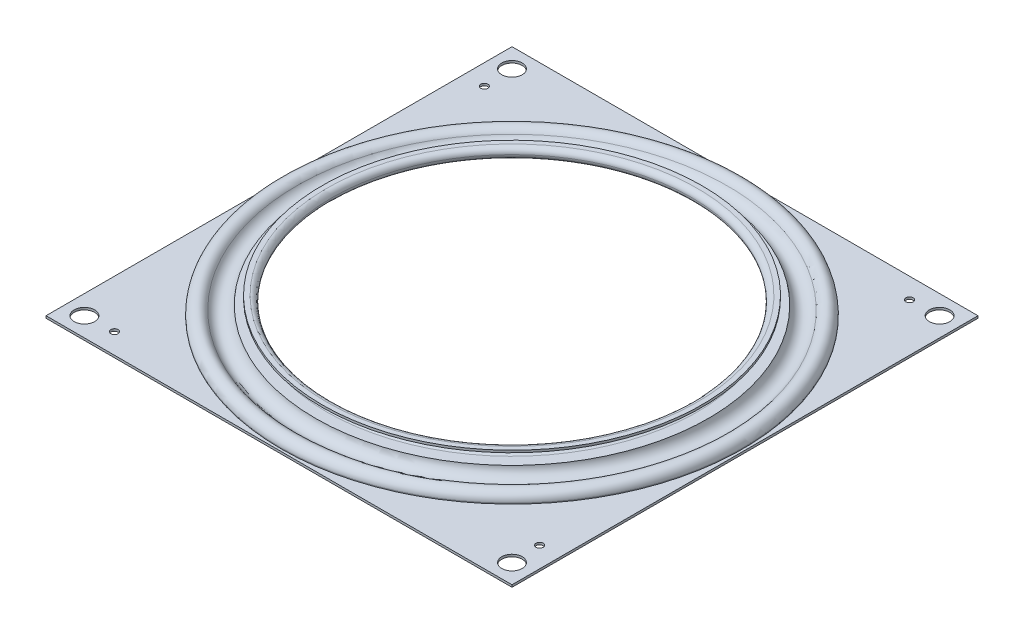
ISO-10303-21;
HEADER;
FILE_DESCRIPTION(('STEP AP214'),'2;1');
FILE_NAME('part.step','',(''),(''),'','','');
FILE_SCHEMA(('AUTOMOTIVE_DESIGN { 1 0 10303 214 1 1 1 1 }'));
ENDSEC;
DATA;
#1=APPLICATION_CONTEXT('core data for automotive mechanical design processes');
#2=APPLICATION_PROTOCOL_DEFINITION('international standard','automotive_design',2000,#1);
#3=PRODUCT_CONTEXT('',#1,'mechanical');
#4=PRODUCT('Part','Part','',(#3));
#5=PRODUCT_RELATED_PRODUCT_CATEGORY('part','',(#4));
#6=PRODUCT_DEFINITION_FORMATION('','',#4);
#7=PRODUCT_DEFINITION_CONTEXT('part definition',#1,'design');
#8=PRODUCT_DEFINITION('design','',#6,#7);
#9=PRODUCT_DEFINITION_SHAPE('','',#8);
#10=(LENGTH_UNIT() NAMED_UNIT(*) SI_UNIT(.MILLI.,.METRE.));
#11=(NAMED_UNIT(*) PLANE_ANGLE_UNIT() SI_UNIT($,.RADIAN.));
#12=(NAMED_UNIT(*) SI_UNIT($,.STERADIAN.) SOLID_ANGLE_UNIT());
#13=UNCERTAINTY_MEASURE_WITH_UNIT(LENGTH_MEASURE(1.E-05),#10,'distance_accuracy_value','');
#14=(GEOMETRIC_REPRESENTATION_CONTEXT(3) GLOBAL_UNCERTAINTY_ASSIGNED_CONTEXT((#13)) GLOBAL_UNIT_ASSIGNED_CONTEXT((#10,
#11,#12)) REPRESENTATION_CONTEXT('',''));
#15=CARTESIAN_POINT('',(0.,0.,0.));
#16=DIRECTION('',(0.,0.,1.));
#17=DIRECTION('',(1.,0.,0.));
#18=AXIS2_PLACEMENT_3D('',#15,#16,#17);
#19=CARTESIAN_POINT('',(0.,0.,0.));
#20=DIRECTION('',(0.,1.,0.));
#21=DIRECTION('',(0.,0.,1.));
#22=AXIS2_PLACEMENT_3D('',#19,#20,#21);
#23=TOROIDAL_SURFACE('',#22,61.214,1.778);
#24=CARTESIAN_POINT('',(0.,-1.77799999999999,0.));
#25=DIRECTION('',(0.,1.,0.));
#26=DIRECTION('',(0.,0.,1.));
#27=AXIS2_PLACEMENT_3D('',#24,#25,#26);
#28=CIRCLE('',#27,61.214);
#29=CARTESIAN_POINT('',(0.,-1.77799999999999,61.214));
#30=VERTEX_POINT('',#29);
#31=EDGE_CURVE('E119',#30,#30,#28,.T.);
#32=ORIENTED_EDGE('',*,*,#31,.F.);
#33=EDGE_LOOP('',(#32));
#34=FACE_BOUND('',#33,.T.);
#35=CARTESIAN_POINT('',(0.,0.,0.));
#36=DIRECTION('',(0.,1.,0.));
#37=DIRECTION('',(0.,0.,1.));
#38=AXIS2_PLACEMENT_3D('',#35,#36,#37);
#39=CIRCLE('',#38,59.436);
#40=CARTESIAN_POINT('',(0.,0.,59.436));
#41=VERTEX_POINT('',#40);
#42=EDGE_CURVE('E11',#41,#41,#39,.T.);
#43=ORIENTED_EDGE('',*,*,#42,.T.);
#44=EDGE_LOOP('',(#43));
#45=FACE_BOUND('',#44,.T.);
#46=ADVANCED_FACE('F37',(#34,#45),#23,.T.);
#47=CARTESIAN_POINT('',(75.5293408614699,-4.82599999999999,0.));
#48=DIRECTION('',(0.,1.,0.));
#49=DIRECTION('',(0.,0.,1.));
#50=AXIS2_PLACEMENT_3D('',#47,#48,#49);
#51=PLANE('',#50);
#52=CARTESIAN_POINT('',(-61.1251000000008,-4.82599999999999,70.2436999999994));
#53=DIRECTION('',(0.,1.,0.));
#54=DIRECTION('',(0.,0.,1.));
#55=AXIS2_PLACEMENT_3D('',#52,#53,#54);
#56=CIRCLE('',#55,1.19062499999999);
#57=CARTESIAN_POINT('',(-61.1251000000008,-4.82599999999999,71.4343249999993));
#58=VERTEX_POINT('',#57);
#59=EDGE_CURVE('E436',#58,#58,#56,.T.);
#60=ORIENTED_EDGE('',*,*,#59,.T.);
#61=EDGE_LOOP('',(#60));
#62=FACE_BOUND('',#61,.T.);
#63=CARTESIAN_POINT('',(70.2436999999996,-4.82599999999999,61.1251000000005));
#64=DIRECTION('',(0.,1.,0.));
#65=DIRECTION('',(0.,0.,1.));
#66=AXIS2_PLACEMENT_3D('',#63,#64,#65);
#67=CIRCLE('',#66,1.19062499999999);
#68=CARTESIAN_POINT('',(70.2436999999996,-4.82599999999999,62.3157250000005));
#69=VERTEX_POINT('',#68);
#70=EDGE_CURVE('E440',#69,#69,#67,.T.);
#71=ORIENTED_EDGE('',*,*,#70,.T.);
#72=EDGE_LOOP('',(#71));
#73=FACE_BOUND('',#72,.T.);
#74=CARTESIAN_POINT('',(61.1251000000003,-4.82599999999999,-70.2436999999998));
#75=DIRECTION('',(0.,1.,0.));
#76=DIRECTION('',(0.,0.,1.));
#77=AXIS2_PLACEMENT_3D('',#74,#75,#76);
#78=CIRCLE('',#77,1.19062499999999);
#79=CARTESIAN_POINT('',(61.1251000000003,-4.82599999999999,-69.0530749999998));
#80=VERTEX_POINT('',#79);
#81=EDGE_CURVE('E449',#80,#80,#78,.T.);
#82=ORIENTED_EDGE('',*,*,#81,.T.);
#83=EDGE_LOOP('',(#82));
#84=FACE_BOUND('',#83,.T.);
#85=CARTESIAN_POINT('',(-70.2437,-4.82599999999999,-61.1251));
#86=DIRECTION('',(0.,1.,0.));
#87=DIRECTION('',(0.,0.,1.));
#88=AXIS2_PLACEMENT_3D('',#85,#86,#87);
#89=CIRCLE('',#88,1.19062499999999);
#90=CARTESIAN_POINT('',(-70.2437,-4.82599999999999,-59.934475));
#91=VERTEX_POINT('',#90);
#92=EDGE_CURVE('E455',#91,#91,#89,.T.);
#93=ORIENTED_EDGE('',*,*,#92,.T.);
#94=EDGE_LOOP('',(#93));
#95=FACE_BOUND('',#94,.T.);
#96=CARTESIAN_POINT('',(70.6501,-4.826,-70.6501));
#97=DIRECTION('',(0.,1.,0.));
#98=DIRECTION('',(0.,0.,1.));
#99=AXIS2_PLACEMENT_3D('',#96,#97,#98);
#100=CIRCLE('',#99,3.3782);
#101=CARTESIAN_POINT('',(70.6501,-4.826,-67.2719));
#102=VERTEX_POINT('',#101);
#103=EDGE_CURVE('E458',#102,#102,#100,.T.);
#104=ORIENTED_EDGE('',*,*,#103,.T.);
#105=EDGE_LOOP('',(#104));
#106=FACE_BOUND('',#105,.T.);
#107=CARTESIAN_POINT('',(70.6501,-4.826,70.6501));
#108=DIRECTION('',(0.,1.,0.));
#109=DIRECTION('',(0.,0.,1.));
#110=AXIS2_PLACEMENT_3D('',#107,#108,#109);
#111=CIRCLE('',#110,3.3782);
#112=CARTESIAN_POINT('',(70.6501,-4.826,74.0283));
#113=VERTEX_POINT('',#112);
#114=EDGE_CURVE('E464',#113,#113,#111,.T.);
#115=ORIENTED_EDGE('',*,*,#114,.T.);
#116=EDGE_LOOP('',(#115));
#117=FACE_BOUND('',#116,.T.);
#118=CARTESIAN_POINT('',(-70.6501,-4.826,-70.6501));
#119=DIRECTION('',(0.,1.,0.));
#120=DIRECTION('',(0.,0.,1.));
#121=AXIS2_PLACEMENT_3D('',#118,#119,#120);
#122=CIRCLE('',#121,3.3782);
#123=CARTESIAN_POINT('',(-70.6501,-4.826,-67.2719));
#124=VERTEX_POINT('',#123);
#125=EDGE_CURVE('E470',#124,#124,#122,.T.);
#126=ORIENTED_EDGE('',*,*,#125,.T.);
#127=EDGE_LOOP('',(#126));
#128=FACE_BOUND('',#127,.T.);
#129=CARTESIAN_POINT('',(-70.6501,-4.826,70.6501));
#130=DIRECTION('',(0.,1.,0.));
#131=DIRECTION('',(0.,0.,1.));
#132=AXIS2_PLACEMENT_3D('',#129,#130,#131);
#133=CIRCLE('',#132,3.3782);
#134=CARTESIAN_POINT('',(-70.6501,-4.826,74.0283));
#135=VERTEX_POINT('',#134);
#136=EDGE_CURVE('E476',#135,#135,#133,.T.);
#137=ORIENTED_EDGE('',*,*,#136,.T.);
#138=EDGE_LOOP('',(#137));
#139=FACE_BOUND('',#138,.T.);
#140=DIRECTION('',(1.,0.,0.));
#141=VECTOR('',#140,1.);
#142=CARTESIAN_POINT('',(77.0001,-4.82599999999999,-77.0001));
#143=LINE('',#142,#141);
#144=CARTESIAN_POINT('',(-77.0001,-4.82599999999999,-77.0001));
#145=VERTEX_POINT('',#144);
#146=CARTESIAN_POINT('',(77.0001,-4.82599999999999,-77.0001));
#147=VERTEX_POINT('',#146);
#148=EDGE_CURVE('E97',#145,#147,#143,.T.);
#149=ORIENTED_EDGE('',*,*,#148,.T.);
#150=DIRECTION('',(0.,0.,1.));
#151=VECTOR('',#150,1.);
#152=CARTESIAN_POINT('',(77.0001,-4.82599999999999,77.0001));
#153=LINE('',#152,#151);
#154=CARTESIAN_POINT('',(77.0001,-4.82599999999999,77.0001));
#155=VERTEX_POINT('',#154);
#156=EDGE_CURVE('E485',#147,#155,#153,.T.);
#157=ORIENTED_EDGE('',*,*,#156,.T.);
#158=DIRECTION('',(-1.,0.,0.));
#159=VECTOR('',#158,1.);
#160=CARTESIAN_POINT('',(77.0001,-4.82599999999999,77.0001));
#161=LINE('',#160,#159);
#162=CARTESIAN_POINT('',(-77.0001,-4.82599999999999,77.0001));
#163=VERTEX_POINT('',#162);
#164=EDGE_CURVE('E482',#155,#163,#161,.T.);
#165=ORIENTED_EDGE('',*,*,#164,.T.);
#166=DIRECTION('',(0.,0.,-1.));
#167=VECTOR('',#166,1.);
#168=CARTESIAN_POINT('',(-77.0001,-4.82599999999999,77.0001));
#169=LINE('',#168,#167);
#170=EDGE_CURVE('E110',#163,#145,#169,.T.);
#171=ORIENTED_EDGE('',*,*,#170,.T.);
#172=EDGE_LOOP('',(#149,#157,#165,#171));
#173=FACE_BOUND('',#172,.T.);
#174=CARTESIAN_POINT('',(0.,-4.82599999999999,0.));
#175=DIRECTION('',(0.,1.,0.));
#176=DIRECTION('',(0.,0.,1.));
#177=AXIS2_PLACEMENT_3D('',#174,#175,#176);
#178=CIRCLE('',#177,75.5293408614699);
#179=CARTESIAN_POINT('',(0.,-4.82599999999999,75.5293408614699));
#180=VERTEX_POINT('',#179);
#181=EDGE_CURVE('E106',#180,#180,#178,.T.);
#182=ORIENTED_EDGE('',*,*,#181,.T.);
#183=EDGE_LOOP('',(#182));
#184=FACE_BOUND('',#183,.T.);
#185=ADVANCED_FACE('F39',(#62,#73,#84,#95,#106,#117,#128,#139,#173,#184),#51,.F.);
#186=CARTESIAN_POINT('',(75.5293408614699,-4.0894,0.));
#187=DIRECTION('',(0.,1.,0.));
#188=DIRECTION('',(0.,0.,1.));
#189=AXIS2_PLACEMENT_3D('',#186,#187,#188);
#190=PLANE('',#189);
#191=CARTESIAN_POINT('',(-61.1251000000008,-4.08939999999999,70.2436999999994));
#192=DIRECTION('',(0.,1.,0.));
#193=DIRECTION('',(0.,0.,1.));
#194=AXIS2_PLACEMENT_3D('',#191,#192,#193);
#195=CIRCLE('',#194,1.19062499999999);
#196=CARTESIAN_POINT('',(-61.1251000000008,-4.08939999999999,71.4343249999993));
#197=VERTEX_POINT('',#196);
#198=EDGE_CURVE('E433',#197,#197,#195,.T.);
#199=ORIENTED_EDGE('',*,*,#198,.F.);
#200=EDGE_LOOP('',(#199));
#201=FACE_BOUND('',#200,.T.);
#202=CARTESIAN_POINT('',(70.2436999999996,-4.08939999999999,61.1251000000005));
#203=DIRECTION('',(0.,1.,0.));
#204=DIRECTION('',(0.,0.,1.));
#205=AXIS2_PLACEMENT_3D('',#202,#203,#204);
#206=CIRCLE('',#205,1.19062499999999);
#207=CARTESIAN_POINT('',(70.2436999999996,-4.08939999999999,62.3157250000005));
#208=VERTEX_POINT('',#207);
#209=EDGE_CURVE('E437',#208,#208,#206,.T.);
#210=ORIENTED_EDGE('',*,*,#209,.F.);
#211=EDGE_LOOP('',(#210));
#212=FACE_BOUND('',#211,.T.);
#213=CARTESIAN_POINT('',(61.1251000000003,-4.08939999999999,-70.2436999999998));
#214=DIRECTION('',(0.,1.,0.));
#215=DIRECTION('',(0.,0.,1.));
#216=AXIS2_PLACEMENT_3D('',#213,#214,#215);
#217=CIRCLE('',#216,1.19062499999999);
#218=CARTESIAN_POINT('',(61.1251000000003,-4.08939999999999,-69.0530749999998));
#219=VERTEX_POINT('',#218);
#220=EDGE_CURVE('E446',#219,#219,#217,.T.);
#221=ORIENTED_EDGE('',*,*,#220,.F.);
#222=EDGE_LOOP('',(#221));
#223=FACE_BOUND('',#222,.T.);
#224=CARTESIAN_POINT('',(-70.2437,-4.08939999999999,-61.1251));
#225=DIRECTION('',(0.,1.,0.));
#226=DIRECTION('',(0.,0.,1.));
#227=AXIS2_PLACEMENT_3D('',#224,#225,#226);
#228=CIRCLE('',#227,1.19062499999999);
#229=CARTESIAN_POINT('',(-70.2437,-4.08939999999999,-59.934475));
#230=VERTEX_POINT('',#229);
#231=EDGE_CURVE('E452',#230,#230,#228,.T.);
#232=ORIENTED_EDGE('',*,*,#231,.F.);
#233=EDGE_LOOP('',(#232));
#234=FACE_BOUND('',#233,.T.);
#235=CARTESIAN_POINT('',(70.6501,-4.0894,-70.6501));
#236=DIRECTION('',(0.,1.,0.));
#237=DIRECTION('',(0.,0.,1.));
#238=AXIS2_PLACEMENT_3D('',#235,#236,#237);
#239=CIRCLE('',#238,3.3782);
#240=CARTESIAN_POINT('',(70.6501,-4.0894,-67.2719));
#241=VERTEX_POINT('',#240);
#242=EDGE_CURVE('E461',#241,#241,#239,.T.);
#243=ORIENTED_EDGE('',*,*,#242,.F.);
#244=EDGE_LOOP('',(#243));
#245=FACE_BOUND('',#244,.T.);
#246=CARTESIAN_POINT('',(70.6501,-4.0894,70.6501));
#247=DIRECTION('',(0.,1.,0.));
#248=DIRECTION('',(0.,0.,1.));
#249=AXIS2_PLACEMENT_3D('',#246,#247,#248);
#250=CIRCLE('',#249,3.3782);
#251=CARTESIAN_POINT('',(70.6501,-4.0894,74.0283));
#252=VERTEX_POINT('',#251);
#253=EDGE_CURVE('E467',#252,#252,#250,.T.);
#254=ORIENTED_EDGE('',*,*,#253,.F.);
#255=EDGE_LOOP('',(#254));
#256=FACE_BOUND('',#255,.T.);
#257=CARTESIAN_POINT('',(-70.6501,-4.0894,-70.6501));
#258=DIRECTION('',(0.,1.,0.));
#259=DIRECTION('',(0.,0.,1.));
#260=AXIS2_PLACEMENT_3D('',#257,#258,#259);
#261=CIRCLE('',#260,3.3782);
#262=CARTESIAN_POINT('',(-70.6501,-4.0894,-67.2719));
#263=VERTEX_POINT('',#262);
#264=EDGE_CURVE('E473',#263,#263,#261,.T.);
#265=ORIENTED_EDGE('',*,*,#264,.F.);
#266=EDGE_LOOP('',(#265));
#267=FACE_BOUND('',#266,.T.);
#268=CARTESIAN_POINT('',(-70.6501,-4.0894,70.6501));
#269=DIRECTION('',(0.,1.,0.));
#270=DIRECTION('',(0.,0.,1.));
#271=AXIS2_PLACEMENT_3D('',#268,#269,#270);
#272=CIRCLE('',#271,3.3782);
#273=CARTESIAN_POINT('',(-70.6501,-4.0894,74.0283));
#274=VERTEX_POINT('',#273);
#275=EDGE_CURVE('E84',#274,#274,#272,.T.);
#276=ORIENTED_EDGE('',*,*,#275,.F.);
#277=EDGE_LOOP('',(#276));
#278=FACE_BOUND('',#277,.T.);
#279=DIRECTION('',(0.,0.,-1.));
#280=VECTOR('',#279,1.);
#281=CARTESIAN_POINT('',(-77.0001,-4.0894,77.0001));
#282=LINE('',#281,#280);
#283=CARTESIAN_POINT('',(-77.0001,-4.0894,77.0001));
#284=VERTEX_POINT('',#283);
#285=CARTESIAN_POINT('',(-77.0001,-4.0894,-77.0001));
#286=VERTEX_POINT('',#285);
#287=EDGE_CURVE('E78',#284,#286,#282,.T.);
#288=ORIENTED_EDGE('',*,*,#287,.F.);
#289=DIRECTION('',(-1.,0.,0.));
#290=VECTOR('',#289,1.);
#291=CARTESIAN_POINT('',(77.0001,-4.0894,77.0001));
#292=LINE('',#291,#290);
#293=CARTESIAN_POINT('',(77.0001,-4.0894,77.0001));
#294=VERTEX_POINT('',#293);
#295=EDGE_CURVE('E59',#294,#284,#292,.T.);
#296=ORIENTED_EDGE('',*,*,#295,.F.);
#297=DIRECTION('',(0.,0.,1.));
#298=VECTOR('',#297,1.);
#299=CARTESIAN_POINT('',(77.0001,-4.0894,77.0001));
#300=LINE('',#299,#298);
#301=CARTESIAN_POINT('',(77.0001,-4.0894,-77.0001));
#302=VERTEX_POINT('',#301);
#303=EDGE_CURVE('E53',#302,#294,#300,.T.);
#304=ORIENTED_EDGE('',*,*,#303,.F.);
#305=DIRECTION('',(1.,0.,0.));
#306=VECTOR('',#305,1.);
#307=CARTESIAN_POINT('',(77.0001,-4.0894,-77.0001));
#308=LINE('',#307,#306);
#309=EDGE_CURVE('E74',#286,#302,#308,.T.);
#310=ORIENTED_EDGE('',*,*,#309,.F.);
#311=EDGE_LOOP('',(#288,#296,#304,#310));
#312=FACE_BOUND('',#311,.T.);
#313=CARTESIAN_POINT('',(0.,-4.08939999999999,0.));
#314=DIRECTION('',(0.,1.,0.));
#315=DIRECTION('',(0.,0.,1.));
#316=AXIS2_PLACEMENT_3D('',#313,#314,#315);
#317=CIRCLE('',#316,76.26594086147);
#318=CARTESIAN_POINT('',(0.,-4.08939999999999,76.26594086147));
#319=VERTEX_POINT('',#318);
#320=EDGE_CURVE('E46',#319,#319,#317,.T.);
#321=ORIENTED_EDGE('',*,*,#320,.F.);
#322=EDGE_LOOP('',(#321));
#323=FACE_BOUND('',#322,.T.);
#324=ADVANCED_FACE('F76',(#201,#212,#223,#234,#245,#256,#267,#278,#312,#323),#190,.T.);
#325=CARTESIAN_POINT('',(0.,21.7127262600922,0.));
#326=DIRECTION('',(0.,1.,0.));
#327=DIRECTION('',(0.,0.,1.));
#328=AXIS2_PLACEMENT_3D('',#325,#326,#327);
#329=CYLINDRICAL_SURFACE('',#328,76.26594086147);
#330=ORIENTED_EDGE('',*,*,#320,.T.);
#331=EDGE_LOOP('',(#330));
#332=FACE_BOUND('',#331,.T.);
#333=CARTESIAN_POINT('',(0.,-3.81,0.));
#334=DIRECTION('',(0.,1.,0.));
#335=DIRECTION('',(0.,0.,1.));
#336=AXIS2_PLACEMENT_3D('',#333,#334,#335);
#337=CIRCLE('',#336,76.26594086147);
#338=CARTESIAN_POINT('',(0.,-3.81,76.26594086147));
#339=VERTEX_POINT('',#338);
#340=EDGE_CURVE('E143',#339,#339,#337,.T.);
#341=ORIENTED_EDGE('',*,*,#340,.F.);
#342=EDGE_LOOP('',(#341));
#343=FACE_BOUND('',#342,.T.);
#344=ADVANCED_FACE('F148',(#332,#343),#329,.T.);
#345=CARTESIAN_POINT('',(0.,-3.81,0.));
#346=DIRECTION('',(0.,1.,0.));
#347=DIRECTION('',(0.,0.,1.));
#348=AXIS2_PLACEMENT_3D('',#345,#346,#347);
#349=TOROIDAL_SURFACE('',#348,73.49734086147,2.76860000000001);
#350=ORIENTED_EDGE('',*,*,#340,.T.);
#351=EDGE_LOOP('',(#350));
#352=FACE_BOUND('',#351,.T.);
#353=CARTESIAN_POINT('',(0.,-2.4257,0.));
#354=DIRECTION('',(0.,1.,0.));
#355=DIRECTION('',(0.,0.,1.));
#356=AXIS2_PLACEMENT_3D('',#353,#354,#355);
#357=CIRCLE('',#356,71.0996629285523);
#358=CARTESIAN_POINT('',(0.,-2.4257,71.0996629285523));
#359=VERTEX_POINT('',#358);
#360=EDGE_CURVE('E140',#359,#359,#357,.T.);
#361=ORIENTED_EDGE('',*,*,#360,.F.);
#362=EDGE_LOOP('',(#361));
#363=FACE_BOUND('',#362,.T.);
#364=ADVANCED_FACE('F156',(#352,#363),#349,.T.);
#365=CARTESIAN_POINT('',(0.,-0.761999999999995,0.));
#366=DIRECTION('',(0.,1.,0.));
#367=DIRECTION('',(0.,0.,1.));
#368=AXIS2_PLACEMENT_3D('',#365,#366,#367);
#369=TOROIDAL_SURFACE('',#368,68.21805,3.32739999999999);
#370=ORIENTED_EDGE('',*,*,#360,.T.);
#371=EDGE_LOOP('',(#370));
#372=FACE_BOUND('',#371,.T.);
#373=CARTESIAN_POINT('',(0.,-1.0414,0.));
#374=DIRECTION('',(0.,1.,0.));
#375=DIRECTION('',(0.,0.,1.));
#376=AXIS2_PLACEMENT_3D('',#373,#374,#375);
#377=CIRCLE('',#376,64.9024012851932);
#378=CARTESIAN_POINT('',(0.,-1.0414,64.9024012851932));
#379=VERTEX_POINT('',#378);
#380=EDGE_CURVE('E137',#379,#379,#377,.T.);
#381=ORIENTED_EDGE('',*,*,#380,.F.);
#382=EDGE_LOOP('',(#381));
#383=FACE_BOUND('',#382,.T.);
#384=ADVANCED_FACE('F206',(#372,#383),#369,.F.);
#385=CARTESIAN_POINT('',(61.214,-1.0414,0.));
#386=DIRECTION('',(0.,1.,0.));
#387=DIRECTION('',(0.,0.,1.));
#388=AXIS2_PLACEMENT_3D('',#385,#386,#387);
#389=PLANE('',#388);
#390=ORIENTED_EDGE('',*,*,#380,.T.);
#391=EDGE_LOOP('',(#390));
#392=FACE_BOUND('',#391,.T.);
#393=CARTESIAN_POINT('',(0.,-1.0414,0.));
#394=DIRECTION('',(0.,1.,0.));
#395=DIRECTION('',(0.,0.,1.));
#396=AXIS2_PLACEMENT_3D('',#393,#394,#395);
#397=CIRCLE('',#396,61.214);
#398=CARTESIAN_POINT('',(0.,-1.0414,61.214));
#399=VERTEX_POINT('',#398);
#400=EDGE_CURVE('E134',#399,#399,#397,.T.);
#401=ORIENTED_EDGE('',*,*,#400,.F.);
#402=EDGE_LOOP('',(#401));
#403=FACE_BOUND('',#402,.T.);
#404=ADVANCED_FACE('F202',(#392,#403),#389,.T.);
#405=CARTESIAN_POINT('',(0.,0.,0.));
#406=DIRECTION('',(0.,1.,0.));
#407=DIRECTION('',(0.,0.,1.));
#408=AXIS2_PLACEMENT_3D('',#405,#406,#407);
#409=TOROIDAL_SURFACE('',#408,61.214,1.0414);
#410=ORIENTED_EDGE('',*,*,#400,.T.);
#411=EDGE_LOOP('',(#410));
#412=FACE_BOUND('',#411,.T.);
#413=CARTESIAN_POINT('',(0.,1.0414,0.));
#414=DIRECTION('',(0.,1.,0.));
#415=DIRECTION('',(0.,0.,1.));
#416=AXIS2_PLACEMENT_3D('',#413,#414,#415);
#417=CIRCLE('',#416,61.214);
#418=CARTESIAN_POINT('',(0.,1.0414,61.214));
#419=VERTEX_POINT('',#418);
#420=EDGE_CURVE('E131',#419,#419,#417,.T.);
#421=ORIENTED_EDGE('',*,*,#420,.F.);
#422=EDGE_LOOP('',(#421));
#423=FACE_BOUND('',#422,.T.);
#424=ADVANCED_FACE('F196',(#412,#423),#409,.F.);
#425=CARTESIAN_POINT('',(62.7485494601266,1.0414,0.));
#426=DIRECTION('',(0.,-1.,0.));
#427=DIRECTION('',(0.,0.,-1.));
#428=AXIS2_PLACEMENT_3D('',#425,#426,#427);
#429=PLANE('',#428);
#430=ORIENTED_EDGE('',*,*,#420,.T.);
#431=EDGE_LOOP('',(#430));
#432=FACE_BOUND('',#431,.T.);
#433=CARTESIAN_POINT('',(0.,1.0414,0.));
#434=DIRECTION('',(0.,1.,0.));
#435=DIRECTION('',(0.,0.,1.));
#436=AXIS2_PLACEMENT_3D('',#433,#434,#435);
#437=CIRCLE('',#436,62.7485494601266);
#438=CARTESIAN_POINT('',(0.,1.0414,62.7485494601266));
#439=VERTEX_POINT('',#438);
#440=EDGE_CURVE('E128',#439,#439,#437,.T.);
#441=ORIENTED_EDGE('',*,*,#440,.F.);
#442=EDGE_LOOP('',(#441));
#443=FACE_BOUND('',#442,.T.);
#444=ADVANCED_FACE('F190',(#432,#443),#429,.T.);
#445=CARTESIAN_POINT('',(0.,21.7127262600922,0.));
#446=DIRECTION('',(0.,1.,0.));
#447=DIRECTION('',(0.,0.,1.));
#448=AXIS2_PLACEMENT_3D('',#445,#446,#447);
#449=CYLINDRICAL_SURFACE('',#448,62.7485494601266);
#450=ORIENTED_EDGE('',*,*,#440,.T.);
#451=EDGE_LOOP('',(#450));
#452=FACE_BOUND('',#451,.T.);
#453=CARTESIAN_POINT('',(0.,1.778,0.));
#454=DIRECTION('',(0.,1.,0.));
#455=DIRECTION('',(0.,0.,1.));
#456=AXIS2_PLACEMENT_3D('',#453,#454,#455);
#457=CIRCLE('',#456,62.7485494601266);
#458=CARTESIAN_POINT('',(0.,1.778,62.7485494601266));
#459=VERTEX_POINT('',#458);
#460=EDGE_CURVE('E125',#459,#459,#457,.T.);
#461=ORIENTED_EDGE('',*,*,#460,.F.);
#462=EDGE_LOOP('',(#461));
#463=FACE_BOUND('',#462,.T.);
#464=ADVANCED_FACE('F181',(#452,#463),#449,.T.);
#465=CARTESIAN_POINT('',(62.7485494601266,1.778,0.));
#466=DIRECTION('',(0.,-1.,0.));
#467=DIRECTION('',(0.,0.,-1.));
#468=AXIS2_PLACEMENT_3D('',#465,#466,#467);
#469=PLANE('',#468);
#470=CARTESIAN_POINT('',(0.,1.778,0.));
#471=DIRECTION('',(0.,1.,0.));
#472=DIRECTION('',(0.,0.,1.));
#473=AXIS2_PLACEMENT_3D('',#470,#471,#472);
#474=CIRCLE('',#473,61.214);
#475=CARTESIAN_POINT('',(0.,1.778,61.214));
#476=VERTEX_POINT('',#475);
#477=EDGE_CURVE('E122',#476,#476,#474,.T.);
#478=ORIENTED_EDGE('',*,*,#477,.F.);
#479=EDGE_LOOP('',(#478));
#480=FACE_BOUND('',#479,.T.);
#481=ORIENTED_EDGE('',*,*,#460,.T.);
#482=EDGE_LOOP('',(#481));
#483=FACE_BOUND('',#482,.T.);
#484=ADVANCED_FACE('F173',(#480,#483),#469,.F.);
#485=ORIENTED_EDGE('',*,*,#42,.F.);
#486=EDGE_LOOP('',(#485));
#487=FACE_BOUND('',#486,.T.);
#488=ORIENTED_EDGE('',*,*,#477,.T.);
#489=EDGE_LOOP('',(#488));
#490=FACE_BOUND('',#489,.T.);
#491=ADVANCED_FACE('F164',(#487,#490),#23,.T.);
#492=CARTESIAN_POINT('',(61.214,-1.778,0.));
#493=DIRECTION('',(0.,1.,0.));
#494=DIRECTION('',(0.,0.,1.));
#495=AXIS2_PLACEMENT_3D('',#492,#493,#494);
#496=PLANE('',#495);
#497=CARTESIAN_POINT('',(0.,-1.778,0.));
#498=DIRECTION('',(0.,1.,0.));
#499=DIRECTION('',(0.,0.,1.));
#500=AXIS2_PLACEMENT_3D('',#497,#498,#499);
#501=CIRCLE('',#500,64.2830989202533);
#502=CARTESIAN_POINT('',(0.,-1.778,64.2830989202533));
#503=VERTEX_POINT('',#502);
#504=EDGE_CURVE('E116',#503,#503,#501,.T.);
#505=ORIENTED_EDGE('',*,*,#504,.F.);
#506=EDGE_LOOP('',(#505));
#507=FACE_BOUND('',#506,.T.);
#508=ORIENTED_EDGE('',*,*,#31,.T.);
#509=EDGE_LOOP('',(#508));
#510=FACE_BOUND('',#509,.T.);
#511=ADVANCED_FACE('F172',(#507,#510),#496,.F.);
#512=CARTESIAN_POINT('',(0.,-0.761999999999995,0.));
#513=DIRECTION('',(0.,1.,0.));
#514=DIRECTION('',(0.,0.,1.));
#515=AXIS2_PLACEMENT_3D('',#512,#513,#514);
#516=TOROIDAL_SURFACE('',#515,68.21805,4.06399999999999);
#517=CARTESIAN_POINT('',(0.,-2.79399999999999,0.));
#518=DIRECTION('',(0.,1.,0.));
#519=DIRECTION('',(0.,0.,1.));
#520=AXIS2_PLACEMENT_3D('',#517,#518,#519);
#521=CIRCLE('',#520,71.73757724098);
#522=CARTESIAN_POINT('',(0.,-2.79399999999999,71.73757724098));
#523=VERTEX_POINT('',#522);
#524=EDGE_CURVE('E113',#523,#523,#521,.T.);
#525=ORIENTED_EDGE('',*,*,#524,.F.);
#526=EDGE_LOOP('',(#525));
#527=FACE_BOUND('',#526,.T.);
#528=ORIENTED_EDGE('',*,*,#504,.T.);
#529=EDGE_LOOP('',(#528));
#530=FACE_BOUND('',#529,.T.);
#531=ADVANCED_FACE('F179',(#527,#530),#516,.T.);
#532=CARTESIAN_POINT('',(0.,-3.81,0.));
#533=DIRECTION('',(0.,1.,0.));
#534=DIRECTION('',(0.,0.,1.));
#535=AXIS2_PLACEMENT_3D('',#532,#533,#534);
#536=TOROIDAL_SURFACE('',#535,73.49734086147,2.03200000000001);
#537=CARTESIAN_POINT('',(0.,-3.81,0.));
#538=DIRECTION('',(0.,1.,0.));
#539=DIRECTION('',(0.,0.,1.));
#540=AXIS2_PLACEMENT_3D('',#537,#538,#539);
#541=CIRCLE('',#540,75.5293408614699);
#542=CARTESIAN_POINT('',(0.,-3.81,75.5293408614699));
#543=VERTEX_POINT('',#542);
#544=EDGE_CURVE('E109',#543,#543,#541,.T.);
#545=ORIENTED_EDGE('',*,*,#544,.F.);
#546=EDGE_LOOP('',(#545));
#547=FACE_BOUND('',#546,.T.);
#548=ORIENTED_EDGE('',*,*,#524,.T.);
#549=EDGE_LOOP('',(#548));
#550=FACE_BOUND('',#549,.T.);
#551=ADVANCED_FACE('F269',(#547,#550),#536,.F.);
#552=CARTESIAN_POINT('',(0.,21.7127262600922,0.));
#553=DIRECTION('',(0.,1.,0.));
#554=DIRECTION('',(0.,0.,1.));
#555=AXIS2_PLACEMENT_3D('',#552,#553,#554);
#556=CYLINDRICAL_SURFACE('',#555,75.5293408614699);
#557=ORIENTED_EDGE('',*,*,#544,.T.);
#558=EDGE_LOOP('',(#557));
#559=FACE_BOUND('',#558,.T.);
#560=ORIENTED_EDGE('',*,*,#181,.F.);
#561=EDGE_LOOP('',(#560));
#562=FACE_BOUND('',#561,.T.);
#563=ADVANCED_FACE('F279',(#559,#562),#556,.F.);
#564=CARTESIAN_POINT('',(77.0001,213.699771448169,-77.0001));
#565=DIRECTION('',(0.,0.,-1.));
#566=DIRECTION('',(-1.,0.,0.));
#567=AXIS2_PLACEMENT_3D('',#564,#565,#566);
#568=PLANE('',#567);
#569=DIRECTION('',(0.,-1.,0.));
#570=VECTOR('',#569,1.);
#571=CARTESIAN_POINT('',(77.0001,213.699771448169,-77.0001));
#572=LINE('',#571,#570);
#573=EDGE_CURVE('E83',#302,#147,#572,.T.);
#574=ORIENTED_EDGE('',*,*,#573,.T.);
#575=ORIENTED_EDGE('',*,*,#148,.F.);
#576=DIRECTION('',(0.,-1.,0.));
#577=VECTOR('',#576,1.);
#578=CARTESIAN_POINT('',(-77.0001,213.699771448169,-77.0001));
#579=LINE('',#578,#577);
#580=EDGE_CURVE('E90',#286,#145,#579,.T.);
#581=ORIENTED_EDGE('',*,*,#580,.F.);
#582=ORIENTED_EDGE('',*,*,#309,.T.);
#583=EDGE_LOOP('',(#574,#575,#581,#582));
#584=FACE_BOUND('',#583,.T.);
#585=ADVANCED_FACE('F95',(#584),#568,.T.);
#586=CARTESIAN_POINT('',(-77.0001,213.699771448169,77.0001));
#587=DIRECTION('',(-1.,0.,0.));
#588=DIRECTION('',(0.,0.,1.));
#589=AXIS2_PLACEMENT_3D('',#586,#587,#588);
#590=PLANE('',#589);
#591=ORIENTED_EDGE('',*,*,#170,.F.);
#592=DIRECTION('',(0.,-1.,0.));
#593=VECTOR('',#592,1.);
#594=CARTESIAN_POINT('',(-77.0001,213.699771448169,77.0001));
#595=LINE('',#594,#593);
#596=EDGE_CURVE('E93',#284,#163,#595,.T.);
#597=ORIENTED_EDGE('',*,*,#596,.F.);
#598=ORIENTED_EDGE('',*,*,#287,.T.);
#599=ORIENTED_EDGE('',*,*,#580,.T.);
#600=EDGE_LOOP('',(#591,#597,#598,#599));
#601=FACE_BOUND('',#600,.T.);
#602=ADVANCED_FACE('F89',(#601),#590,.T.);
#603=CARTESIAN_POINT('',(77.0001,213.699771448169,77.0001));
#604=DIRECTION('',(0.,0.,1.));
#605=DIRECTION('',(1.,0.,0.));
#606=AXIS2_PLACEMENT_3D('',#603,#604,#605);
#607=PLANE('',#606);
#608=ORIENTED_EDGE('',*,*,#164,.F.);
#609=DIRECTION('',(0.,-1.,0.));
#610=VECTOR('',#609,1.);
#611=CARTESIAN_POINT('',(77.0001,213.699771448169,77.0001));
#612=LINE('',#611,#610);
#613=EDGE_CURVE('E102',#294,#155,#612,.T.);
#614=ORIENTED_EDGE('',*,*,#613,.F.);
#615=ORIENTED_EDGE('',*,*,#295,.T.);
#616=ORIENTED_EDGE('',*,*,#596,.T.);
#617=EDGE_LOOP('',(#608,#614,#615,#616));
#618=FACE_BOUND('',#617,.T.);
#619=ADVANCED_FACE('F308',(#618),#607,.T.);
#620=CARTESIAN_POINT('',(77.0001,213.699771448169,77.0001));
#621=DIRECTION('',(1.,0.,0.));
#622=DIRECTION('',(0.,0.,-1.));
#623=AXIS2_PLACEMENT_3D('',#620,#621,#622);
#624=PLANE('',#623);
#625=ORIENTED_EDGE('',*,*,#156,.F.);
#626=ORIENTED_EDGE('',*,*,#573,.F.);
#627=ORIENTED_EDGE('',*,*,#303,.T.);
#628=ORIENTED_EDGE('',*,*,#613,.T.);
#629=EDGE_LOOP('',(#625,#626,#627,#628));
#630=FACE_BOUND('',#629,.T.);
#631=ADVANCED_FACE('F317',(#630),#624,.T.);
#632=CARTESIAN_POINT('',(-70.6501,-4.0894,70.6501));
#633=DIRECTION('',(0.,1.,0.));
#634=DIRECTION('',(0.,0.,1.));
#635=AXIS2_PLACEMENT_3D('',#632,#633,#634);
#636=CYLINDRICAL_SURFACE('',#635,3.3782);
#637=ORIENTED_EDGE('',*,*,#136,.F.);
#638=EDGE_LOOP('',(#637));
#639=FACE_BOUND('',#638,.T.);
#640=ORIENTED_EDGE('',*,*,#275,.T.);
#641=EDGE_LOOP('',(#640));
#642=FACE_BOUND('',#641,.T.);
#643=ADVANCED_FACE('F327',(#639,#642),#636,.F.);
#644=CARTESIAN_POINT('',(-70.6501,-4.0894,-70.6501));
#645=DIRECTION('',(0.,1.,0.));
#646=DIRECTION('',(0.,0.,1.));
#647=AXIS2_PLACEMENT_3D('',#644,#645,#646);
#648=CYLINDRICAL_SURFACE('',#647,3.3782);
#649=ORIENTED_EDGE('',*,*,#125,.F.);
#650=EDGE_LOOP('',(#649));
#651=FACE_BOUND('',#650,.T.);
#652=ORIENTED_EDGE('',*,*,#264,.T.);
#653=EDGE_LOOP('',(#652));
#654=FACE_BOUND('',#653,.T.);
#655=ADVANCED_FACE('F337',(#651,#654),#648,.F.);
#656=CARTESIAN_POINT('',(70.6501,-4.0894,70.6501));
#657=DIRECTION('',(0.,1.,0.));
#658=DIRECTION('',(0.,0.,1.));
#659=AXIS2_PLACEMENT_3D('',#656,#657,#658);
#660=CYLINDRICAL_SURFACE('',#659,3.3782);
#661=ORIENTED_EDGE('',*,*,#114,.F.);
#662=EDGE_LOOP('',(#661));
#663=FACE_BOUND('',#662,.T.);
#664=ORIENTED_EDGE('',*,*,#253,.T.);
#665=EDGE_LOOP('',(#664));
#666=FACE_BOUND('',#665,.T.);
#667=ADVANCED_FACE('F347',(#663,#666),#660,.F.);
#668=CARTESIAN_POINT('',(70.6501,-4.0894,-70.6501));
#669=DIRECTION('',(0.,1.,0.));
#670=DIRECTION('',(0.,0.,1.));
#671=AXIS2_PLACEMENT_3D('',#668,#669,#670);
#672=CYLINDRICAL_SURFACE('',#671,3.3782);
#673=ORIENTED_EDGE('',*,*,#103,.F.);
#674=EDGE_LOOP('',(#673));
#675=FACE_BOUND('',#674,.T.);
#676=ORIENTED_EDGE('',*,*,#242,.T.);
#677=EDGE_LOOP('',(#676));
#678=FACE_BOUND('',#677,.T.);
#679=ADVANCED_FACE('F357',(#675,#678),#672,.F.);
#680=CARTESIAN_POINT('',(-70.2437,-4.0894,-61.1251));
#681=DIRECTION('',(0.,1.,0.));
#682=DIRECTION('',(0.,0.,1.));
#683=AXIS2_PLACEMENT_3D('',#680,#681,#682);
#684=CYLINDRICAL_SURFACE('',#683,1.19062499999999);
#685=ORIENTED_EDGE('',*,*,#231,.T.);
#686=EDGE_LOOP('',(#685));
#687=FACE_BOUND('',#686,.T.);
#688=ORIENTED_EDGE('',*,*,#92,.F.);
#689=EDGE_LOOP('',(#688));
#690=FACE_BOUND('',#689,.T.);
#691=ADVANCED_FACE('F367',(#687,#690),#684,.F.);
#692=CARTESIAN_POINT('',(61.1251000000003,-4.0894,-70.2436999999998));
#693=DIRECTION('',(0.,1.,0.));
#694=DIRECTION('',(0.,0.,1.));
#695=AXIS2_PLACEMENT_3D('',#692,#693,#694);
#696=CYLINDRICAL_SURFACE('',#695,1.19062499999999);
#697=ORIENTED_EDGE('',*,*,#220,.T.);
#698=EDGE_LOOP('',(#697));
#699=FACE_BOUND('',#698,.T.);
#700=ORIENTED_EDGE('',*,*,#81,.F.);
#701=EDGE_LOOP('',(#700));
#702=FACE_BOUND('',#701,.T.);
#703=ADVANCED_FACE('F376',(#699,#702),#696,.F.);
#704=CARTESIAN_POINT('',(70.2436999999996,-4.0894,61.1251000000005));
#705=DIRECTION('',(0.,1.,0.));
#706=DIRECTION('',(0.,0.,1.));
#707=AXIS2_PLACEMENT_3D('',#704,#705,#706);
#708=CYLINDRICAL_SURFACE('',#707,1.19062499999999);
#709=ORIENTED_EDGE('',*,*,#209,.T.);
#710=EDGE_LOOP('',(#709));
#711=FACE_BOUND('',#710,.T.);
#712=ORIENTED_EDGE('',*,*,#70,.F.);
#713=EDGE_LOOP('',(#712));
#714=FACE_BOUND('',#713,.T.);
#715=ADVANCED_FACE('F407',(#711,#714),#708,.F.);
#716=CARTESIAN_POINT('',(-61.1251000000008,-4.0894,70.2436999999994));
#717=DIRECTION('',(0.,1.,0.));
#718=DIRECTION('',(0.,0.,1.));
#719=AXIS2_PLACEMENT_3D('',#716,#717,#718);
#720=CYLINDRICAL_SURFACE('',#719,1.19062499999999);
#721=ORIENTED_EDGE('',*,*,#198,.T.);
#722=EDGE_LOOP('',(#721));
#723=FACE_BOUND('',#722,.T.);
#724=ORIENTED_EDGE('',*,*,#59,.F.);
#725=EDGE_LOOP('',(#724));
#726=FACE_BOUND('',#725,.T.);
#727=ADVANCED_FACE('F417',(#723,#726),#720,.F.);
#728=CLOSED_SHELL('',(#46,#185,#324,#344,#364,#384,#404,#424,#444,#464,#484,#491,#511,#531,#551,
#563,#585,#602,#619,#631,#643,#655,#667,#679,#691,#703,#715,#727));
#729=MANIFOLD_SOLID_BREP('B2',#728);
#730=ADVANCED_BREP_SHAPE_REPRESENTATION('',(#18,#729),#14);
#731=SHAPE_DEFINITION_REPRESENTATION(#9,#730);
ENDSEC;
END-ISO-10303-21;
